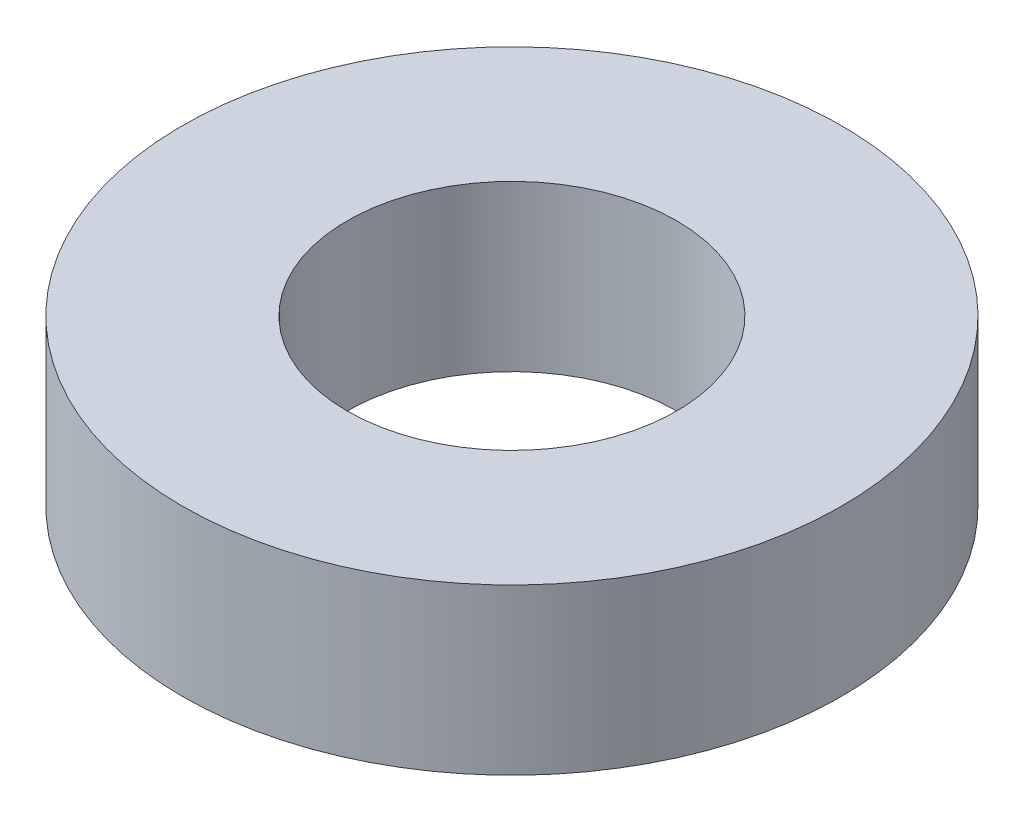
ISO-10303-21;
HEADER;
FILE_DESCRIPTION(('STEP AP214'),'2;1');
FILE_NAME('part.step','',(''),(''),'','','');
FILE_SCHEMA(('AUTOMOTIVE_DESIGN { 1 0 10303 214 1 1 1 1 }'));
ENDSEC;
DATA;
#1=APPLICATION_CONTEXT('core data for automotive mechanical design processes');
#2=APPLICATION_PROTOCOL_DEFINITION('international standard','automotive_design',2000,#1);
#3=PRODUCT_CONTEXT('',#1,'mechanical');
#4=PRODUCT('Part','Part','',(#3));
#5=PRODUCT_RELATED_PRODUCT_CATEGORY('part','',(#4));
#6=PRODUCT_DEFINITION_FORMATION('','',#4);
#7=PRODUCT_DEFINITION_CONTEXT('part definition',#1,'design');
#8=PRODUCT_DEFINITION('design','',#6,#7);
#9=PRODUCT_DEFINITION_SHAPE('','',#8);
#10=(LENGTH_UNIT() NAMED_UNIT(*) SI_UNIT(.MILLI.,.METRE.));
#11=(NAMED_UNIT(*) PLANE_ANGLE_UNIT() SI_UNIT($,.RADIAN.));
#12=(NAMED_UNIT(*) SI_UNIT($,.STERADIAN.) SOLID_ANGLE_UNIT());
#13=UNCERTAINTY_MEASURE_WITH_UNIT(LENGTH_MEASURE(1.E-05),#10,'distance_accuracy_value','');
#14=(GEOMETRIC_REPRESENTATION_CONTEXT(3) GLOBAL_UNCERTAINTY_ASSIGNED_CONTEXT((#13)) GLOBAL_UNIT_ASSIGNED_CONTEXT((#10,
#11,#12)) REPRESENTATION_CONTEXT('',''));
#15=CARTESIAN_POINT('',(0.,0.,0.));
#16=DIRECTION('',(0.,0.,1.));
#17=DIRECTION('',(1.,0.,0.));
#18=AXIS2_PLACEMENT_3D('',#15,#16,#17);
#19=CARTESIAN_POINT('',(0.,3.,0.));
#20=DIRECTION('',(0.,-1.,0.));
#21=DIRECTION('',(0.,0.,-1.));
#22=AXIS2_PLACEMENT_3D('',#19,#20,#21);
#23=CYLINDRICAL_SURFACE('',#22,6.);
#24=CARTESIAN_POINT('',(0.,3.,0.));
#25=DIRECTION('',(0.,1.,0.));
#26=DIRECTION('',(0.,0.,1.));
#27=AXIS2_PLACEMENT_3D('',#24,#25,#26);
#28=CIRCLE('',#27,6.);
#29=CARTESIAN_POINT('',(0.,3.,6.));
#30=VERTEX_POINT('',#29);
#31=EDGE_CURVE('E10',#30,#30,#28,.T.);
#32=ORIENTED_EDGE('',*,*,#31,.F.);
#33=EDGE_LOOP('',(#32));
#34=FACE_BOUND('',#33,.T.);
#35=CARTESIAN_POINT('',(0.,0.,0.));
#36=DIRECTION('',(0.,1.,0.));
#37=DIRECTION('',(0.,0.,1.));
#38=AXIS2_PLACEMENT_3D('',#35,#36,#37);
#39=CIRCLE('',#38,6.);
#40=CARTESIAN_POINT('',(0.,0.,6.));
#41=VERTEX_POINT('',#40);
#42=EDGE_CURVE('E38',#41,#41,#39,.T.);
#43=ORIENTED_EDGE('',*,*,#42,.T.);
#44=EDGE_LOOP('',(#43));
#45=FACE_BOUND('',#44,.T.);
#46=ADVANCED_FACE('F35',(#34,#45),#23,.T.);
#47=CARTESIAN_POINT('',(0.,3.,0.));
#48=DIRECTION('',(0.,1.,0.));
#49=DIRECTION('',(0.,0.,1.));
#50=AXIS2_PLACEMENT_3D('',#47,#48,#49);
#51=PLANE('',#50);
#52=CARTESIAN_POINT('',(0.,3.,0.));
#53=DIRECTION('',(0.,1.,0.));
#54=DIRECTION('',(0.,0.,1.));
#55=AXIS2_PLACEMENT_3D('',#52,#53,#54);
#56=CIRCLE('',#55,3.);
#57=CARTESIAN_POINT('',(0.,3.,3.));
#58=VERTEX_POINT('',#57);
#59=EDGE_CURVE('E47',#58,#58,#56,.T.);
#60=ORIENTED_EDGE('',*,*,#59,.F.);
#61=EDGE_LOOP('',(#60));
#62=FACE_BOUND('',#61,.T.);
#63=ORIENTED_EDGE('',*,*,#31,.T.);
#64=EDGE_LOOP('',(#63));
#65=FACE_BOUND('',#64,.T.);
#66=ADVANCED_FACE('F62',(#62,#65),#51,.T.);
#67=CARTESIAN_POINT('',(0.,0.,0.));
#68=DIRECTION('',(0.,1.,0.));
#69=DIRECTION('',(0.,0.,1.));
#70=AXIS2_PLACEMENT_3D('',#67,#68,#69);
#71=PLANE('',#70);
#72=CARTESIAN_POINT('',(0.,0.,0.));
#73=DIRECTION('',(0.,1.,0.));
#74=DIRECTION('',(0.,0.,1.));
#75=AXIS2_PLACEMENT_3D('',#72,#73,#74);
#76=CIRCLE('',#75,3.);
#77=CARTESIAN_POINT('',(0.,0.,3.));
#78=VERTEX_POINT('',#77);
#79=EDGE_CURVE('E45',#78,#78,#76,.T.);
#80=ORIENTED_EDGE('',*,*,#79,.T.);
#81=EDGE_LOOP('',(#80));
#82=FACE_BOUND('',#81,.T.);
#83=ORIENTED_EDGE('',*,*,#42,.F.);
#84=EDGE_LOOP('',(#83));
#85=FACE_BOUND('',#84,.T.);
#86=ADVANCED_FACE('F53',(#82,#85),#71,.F.);
#87=CARTESIAN_POINT('',(0.,0.,0.));
#88=DIRECTION('',(0.,1.,0.));
#89=DIRECTION('',(0.,0.,1.));
#90=AXIS2_PLACEMENT_3D('',#87,#88,#89);
#91=CYLINDRICAL_SURFACE('',#90,3.);
#92=ORIENTED_EDGE('',*,*,#79,.F.);
#93=EDGE_LOOP('',(#92));
#94=FACE_BOUND('',#93,.T.);
#95=ORIENTED_EDGE('',*,*,#59,.T.);
#96=EDGE_LOOP('',(#95));
#97=FACE_BOUND('',#96,.T.);
#98=ADVANCED_FACE('F56',(#94,#97),#91,.F.);
#99=CLOSED_SHELL('',(#46,#66,#86,#98));
#100=MANIFOLD_SOLID_BREP('B2',#99);
#101=ADVANCED_BREP_SHAPE_REPRESENTATION('',(#18,#100),#14);
#102=SHAPE_DEFINITION_REPRESENTATION(#9,#101);
ENDSEC;
END-ISO-10303-21;
